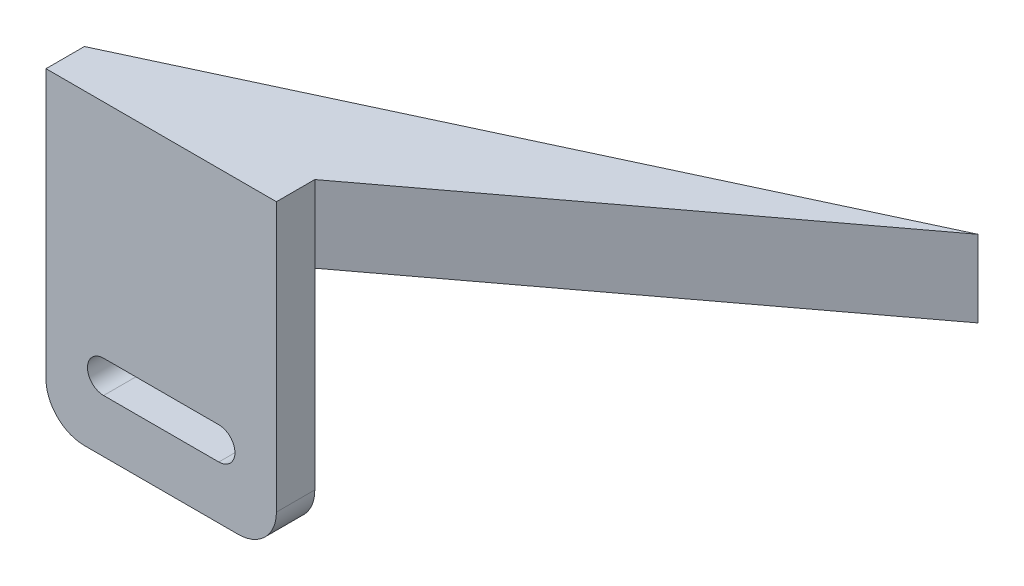
ISO-10303-21;
HEADER;
FILE_DESCRIPTION(('STEP AP214'),'2;1');
FILE_NAME('part.step','',(''),(''),'','','');
FILE_SCHEMA(('AUTOMOTIVE_DESIGN { 1 0 10303 214 1 1 1 1 }'));
ENDSEC;
DATA;
#1=APPLICATION_CONTEXT('core data for automotive mechanical design processes');
#2=APPLICATION_PROTOCOL_DEFINITION('international standard','automotive_design',2000,#1);
#3=PRODUCT_CONTEXT('',#1,'mechanical');
#4=PRODUCT('Part','Part','',(#3));
#5=PRODUCT_RELATED_PRODUCT_CATEGORY('part','',(#4));
#6=PRODUCT_DEFINITION_FORMATION('','',#4);
#7=PRODUCT_DEFINITION_CONTEXT('part definition',#1,'design');
#8=PRODUCT_DEFINITION('design','',#6,#7);
#9=PRODUCT_DEFINITION_SHAPE('','',#8);
#10=(LENGTH_UNIT() NAMED_UNIT(*) SI_UNIT(.MILLI.,.METRE.));
#11=(NAMED_UNIT(*) PLANE_ANGLE_UNIT() SI_UNIT($,.RADIAN.));
#12=(NAMED_UNIT(*) SI_UNIT($,.STERADIAN.) SOLID_ANGLE_UNIT());
#13=UNCERTAINTY_MEASURE_WITH_UNIT(LENGTH_MEASURE(1.E-05),#10,'distance_accuracy_value','');
#14=(GEOMETRIC_REPRESENTATION_CONTEXT(3) GLOBAL_UNCERTAINTY_ASSIGNED_CONTEXT((#13)) GLOBAL_UNIT_ASSIGNED_CONTEXT((#10,
#11,#12)) REPRESENTATION_CONTEXT('',''));
#15=CARTESIAN_POINT('',(0.,0.,0.));
#16=DIRECTION('',(0.,0.,1.));
#17=DIRECTION('',(1.,0.,0.));
#18=AXIS2_PLACEMENT_3D('',#15,#16,#17);
#19=CARTESIAN_POINT('',(0.,0.,0.));
#20=DIRECTION('',(0.,0.,-1.));
#21=DIRECTION('',(-1.,0.,0.));
#22=AXIS2_PLACEMENT_3D('',#19,#20,#21);
#23=PLANE('',#22);
#24=CARTESIAN_POINT('',(7.5,-11.,0.));
#25=DIRECTION('',(0.,0.,-1.));
#26=DIRECTION('',(-1.,0.,0.));
#27=AXIS2_PLACEMENT_3D('',#24,#25,#26);
#28=CIRCLE('',#27,2.1);
#29=CARTESIAN_POINT('',(7.5,-8.9,0.));
#30=VERTEX_POINT('',#29);
#31=CARTESIAN_POINT('',(7.5,-13.1,0.));
#32=VERTEX_POINT('',#31);
#33=EDGE_CURVE('E155',#30,#32,#28,.T.);
#34=ORIENTED_EDGE('',*,*,#33,.F.);
#35=DIRECTION('',(1.,0.,0.));
#36=VECTOR('',#35,1.);
#37=CARTESIAN_POINT('',(0.,-8.9,0.));
#38=LINE('',#37,#36);
#39=CARTESIAN_POINT('',(-7.5,-8.9,0.));
#40=VERTEX_POINT('',#39);
#41=EDGE_CURVE('E148',#40,#30,#38,.T.);
#42=ORIENTED_EDGE('',*,*,#41,.F.);
#43=CARTESIAN_POINT('',(-7.5,-11.,0.));
#44=DIRECTION('',(0.,0.,-1.));
#45=DIRECTION('',(-1.,0.,0.));
#46=AXIS2_PLACEMENT_3D('',#43,#44,#45);
#47=CIRCLE('',#46,2.1);
#48=CARTESIAN_POINT('',(-7.5,-13.1,0.));
#49=VERTEX_POINT('',#48);
#50=EDGE_CURVE('E128',#49,#40,#47,.T.);
#51=ORIENTED_EDGE('',*,*,#50,.F.);
#52=DIRECTION('',(-1.,0.,0.));
#53=VECTOR('',#52,1.);
#54=CARTESIAN_POINT('',(0.,-13.1,0.));
#55=LINE('',#54,#53);
#56=EDGE_CURVE('E153',#32,#49,#55,.T.);
#57=ORIENTED_EDGE('',*,*,#56,.F.);
#58=EDGE_LOOP('',(#34,#42,#51,#57));
#59=FACE_BOUND('',#58,.T.);
#60=DIRECTION('',(1.,0.,0.));
#61=VECTOR('',#60,1.);
#62=CARTESIAN_POINT('',(-15.,-20.,0.));
#63=LINE('',#62,#61);
#64=CARTESIAN_POINT('',(-10.,-20.,0.));
#65=VERTEX_POINT('',#64);
#66=CARTESIAN_POINT('',(10.,-20.,0.));
#67=VERTEX_POINT('',#66);
#68=EDGE_CURVE('E181',#65,#67,#63,.T.);
#69=ORIENTED_EDGE('',*,*,#68,.F.);
#70=CARTESIAN_POINT('',(-10.,-15.,0.));
#71=DIRECTION('',(0.,0.,-1.));
#72=DIRECTION('',(-1.,0.,0.));
#73=AXIS2_PLACEMENT_3D('',#70,#71,#72);
#74=CIRCLE('',#73,5.);
#75=CARTESIAN_POINT('',(-15.,-15.,0.));
#76=VERTEX_POINT('',#75);
#77=EDGE_CURVE('E209',#65,#76,#74,.T.);
#78=ORIENTED_EDGE('',*,*,#77,.T.);
#79=DIRECTION('',(0.,-1.,0.));
#80=VECTOR('',#79,1.);
#81=CARTESIAN_POINT('',(-15.,-20.,0.));
#82=LINE('',#81,#80);
#83=CARTESIAN_POINT('',(-15.,10.,0.));
#84=VERTEX_POINT('',#83);
#85=EDGE_CURVE('E191',#84,#76,#82,.T.);
#86=ORIENTED_EDGE('',*,*,#85,.F.);
#87=DIRECTION('',(1.,0.,0.));
#88=VECTOR('',#87,1.);
#89=CARTESIAN_POINT('',(15.,10.,0.));
#90=LINE('',#89,#88);
#91=CARTESIAN_POINT('',(15.,9.99999999999999,0.));
#92=VERTEX_POINT('',#91);
#93=EDGE_CURVE('E158',#84,#92,#90,.T.);
#94=ORIENTED_EDGE('',*,*,#93,.T.);
#95=DIRECTION('',(0.,1.,0.));
#96=VECTOR('',#95,1.);
#97=CARTESIAN_POINT('',(15.,-20.,0.));
#98=LINE('',#97,#96);
#99=CARTESIAN_POINT('',(15.,-15.,0.));
#100=VERTEX_POINT('',#99);
#101=EDGE_CURVE('E175',#100,#92,#98,.T.);
#102=ORIENTED_EDGE('',*,*,#101,.F.);
#103=CARTESIAN_POINT('',(10.,-15.,0.));
#104=DIRECTION('',(0.,0.,-1.));
#105=DIRECTION('',(-1.,0.,0.));
#106=AXIS2_PLACEMENT_3D('',#103,#104,#105);
#107=CIRCLE('',#106,5.);
#108=EDGE_CURVE('E207',#100,#67,#107,.T.);
#109=ORIENTED_EDGE('',*,*,#108,.T.);
#110=EDGE_LOOP('',(#69,#78,#86,#94,#102,#109));
#111=FACE_BOUND('',#110,.T.);
#112=ADVANCED_FACE('F33',(#59,#111),#23,.T.);
#113=CARTESIAN_POINT('',(15.,-20.,5.));
#114=DIRECTION('',(-1.,0.,0.));
#115=DIRECTION('',(0.,0.,1.));
#116=AXIS2_PLACEMENT_3D('',#113,#114,#115);
#117=PLANE('',#116);
#118=DIRECTION('',(0.,1.,0.));
#119=VECTOR('',#118,1.);
#120=CARTESIAN_POINT('',(15.,-20.,5.));
#121=LINE('',#120,#119);
#122=CARTESIAN_POINT('',(15.,-15.,5.));
#123=VERTEX_POINT('',#122);
#124=CARTESIAN_POINT('',(15.,20.,5.));
#125=VERTEX_POINT('',#124);
#126=EDGE_CURVE('E178',#123,#125,#121,.T.);
#127=ORIENTED_EDGE('',*,*,#126,.F.);
#128=DIRECTION('',(0.,0.,-1.));
#129=VECTOR('',#128,1.);
#130=CARTESIAN_POINT('',(15.,-15.,5.));
#131=LINE('',#130,#129);
#132=EDGE_CURVE('E11',#123,#100,#131,.T.);
#133=ORIENTED_EDGE('',*,*,#132,.T.);
#134=ORIENTED_EDGE('',*,*,#101,.T.);
#135=DIRECTION('',(0.,1.,0.));
#136=VECTOR('',#135,1.);
#137=CARTESIAN_POINT('',(15.,10.,0.));
#138=LINE('',#137,#136);
#139=CARTESIAN_POINT('',(15.,20.,0.));
#140=VERTEX_POINT('',#139);
#141=EDGE_CURVE('E168',#92,#140,#138,.T.);
#142=ORIENTED_EDGE('',*,*,#141,.T.);
#143=DIRECTION('',(0.,0.,-1.));
#144=VECTOR('',#143,1.);
#145=CARTESIAN_POINT('',(15.,20.,5.));
#146=LINE('',#145,#144);
#147=EDGE_CURVE('E199',#125,#140,#146,.T.);
#148=ORIENTED_EDGE('',*,*,#147,.F.);
#149=EDGE_LOOP('',(#127,#133,#134,#142,#148));
#150=FACE_BOUND('',#149,.T.);
#151=ADVANCED_FACE('F245',(#150),#117,.F.);
#152=CARTESIAN_POINT('',(-15.,20.,5.));
#153=DIRECTION('',(0.,-1.,0.));
#154=DIRECTION('',(0.,0.,-1.));
#155=AXIS2_PLACEMENT_3D('',#152,#153,#154);
#156=PLANE('',#155);
#157=ORIENTED_EDGE('',*,*,#147,.T.);
#158=DIRECTION('',(0.800078339231548,0.,-0.599895533482696));
#159=VECTOR('',#158,1.);
#160=CARTESIAN_POINT('',(64.3467560588549,20.,-37.));
#161=LINE('',#160,#159);
#162=CARTESIAN_POINT('',(64.3467560588549,20.,-37.));
#163=VERTEX_POINT('',#162);
#164=EDGE_CURVE('E157',#140,#163,#161,.T.);
#165=ORIENTED_EDGE('',*,*,#164,.T.);
#166=DIRECTION('',(-0.906307787036653,0.,0.422618261740694));
#167=VECTOR('',#166,1.);
#168=CARTESIAN_POINT('',(-15.,20.,0.));
#169=LINE('',#168,#167);
#170=CARTESIAN_POINT('',(-15.,20.,0.));
#171=VERTEX_POINT('',#170);
#172=EDGE_CURVE('E162',#163,#171,#169,.T.);
#173=ORIENTED_EDGE('',*,*,#172,.T.);
#174=DIRECTION('',(0.,0.,-1.));
#175=VECTOR('',#174,1.);
#176=CARTESIAN_POINT('',(-15.,20.,5.));
#177=LINE('',#176,#175);
#178=CARTESIAN_POINT('',(-15.,20.,5.));
#179=VERTEX_POINT('',#178);
#180=EDGE_CURVE('E189',#179,#171,#177,.T.);
#181=ORIENTED_EDGE('',*,*,#180,.F.);
#182=DIRECTION('',(-1.,0.,0.));
#183=VECTOR('',#182,1.);
#184=CARTESIAN_POINT('',(-15.,20.,5.));
#185=LINE('',#184,#183);
#186=EDGE_CURVE('E180',#125,#179,#185,.T.);
#187=ORIENTED_EDGE('',*,*,#186,.F.);
#188=EDGE_LOOP('',(#157,#165,#173,#181,#187));
#189=FACE_BOUND('',#188,.T.);
#190=ADVANCED_FACE('F237',(#189),#156,.F.);
#191=CARTESIAN_POINT('',(-15.,-20.,5.));
#192=DIRECTION('',(1.,0.,0.));
#193=DIRECTION('',(0.,0.,-1.));
#194=AXIS2_PLACEMENT_3D('',#191,#192,#193);
#195=PLANE('',#194);
#196=ORIENTED_EDGE('',*,*,#85,.T.);
#197=DIRECTION('',(0.,0.,-1.));
#198=VECTOR('',#197,1.);
#199=CARTESIAN_POINT('',(-15.,-15.,5.));
#200=LINE('',#199,#198);
#201=CARTESIAN_POINT('',(-15.,-15.,5.));
#202=VERTEX_POINT('',#201);
#203=EDGE_CURVE('E211',#76,#202,#200,.F.);
#204=ORIENTED_EDGE('',*,*,#203,.T.);
#205=DIRECTION('',(0.,-1.,0.));
#206=VECTOR('',#205,1.);
#207=CARTESIAN_POINT('',(-15.,-20.,5.));
#208=LINE('',#207,#206);
#209=EDGE_CURVE('E183',#179,#202,#208,.T.);
#210=ORIENTED_EDGE('',*,*,#209,.F.);
#211=ORIENTED_EDGE('',*,*,#180,.T.);
#212=EDGE_CURVE('E192',#171,#84,#82,.T.);
#213=ORIENTED_EDGE('',*,*,#212,.T.);
#214=EDGE_LOOP('',(#196,#204,#210,#211,#213));
#215=FACE_BOUND('',#214,.T.);
#216=ADVANCED_FACE('F230',(#215),#195,.F.);
#217=CARTESIAN_POINT('',(-15.,-20.,5.));
#218=DIRECTION('',(0.,1.,0.));
#219=DIRECTION('',(0.,0.,1.));
#220=AXIS2_PLACEMENT_3D('',#217,#218,#219);
#221=PLANE('',#220);
#222=DIRECTION('',(1.,0.,0.));
#223=VECTOR('',#222,1.);
#224=CARTESIAN_POINT('',(-15.,-20.,5.));
#225=LINE('',#224,#223);
#226=CARTESIAN_POINT('',(-10.,-20.,5.));
#227=VERTEX_POINT('',#226);
#228=CARTESIAN_POINT('',(10.,-20.,5.));
#229=VERTEX_POINT('',#228);
#230=EDGE_CURVE('E186',#227,#229,#225,.T.);
#231=ORIENTED_EDGE('',*,*,#230,.F.);
#232=DIRECTION('',(0.,0.,-1.));
#233=VECTOR('',#232,1.);
#234=CARTESIAN_POINT('',(-10.,-20.,5.));
#235=LINE('',#234,#233);
#236=EDGE_CURVE('E204',#227,#65,#235,.T.);
#237=ORIENTED_EDGE('',*,*,#236,.T.);
#238=ORIENTED_EDGE('',*,*,#68,.T.);
#239=DIRECTION('',(0.,0.,-1.));
#240=VECTOR('',#239,1.);
#241=CARTESIAN_POINT('',(10.,-20.,5.));
#242=LINE('',#241,#240);
#243=EDGE_CURVE('E202',#67,#229,#242,.F.);
#244=ORIENTED_EDGE('',*,*,#243,.T.);
#245=EDGE_LOOP('',(#231,#237,#238,#244));
#246=FACE_BOUND('',#245,.T.);
#247=ADVANCED_FACE('F222',(#246),#221,.F.);
#248=CARTESIAN_POINT('',(0.,0.,5.));
#249=DIRECTION('',(0.,0.,-1.));
#250=DIRECTION('',(-1.,0.,0.));
#251=AXIS2_PLACEMENT_3D('',#248,#249,#250);
#252=PLANE('',#251);
#253=DIRECTION('',(-1.,0.,0.));
#254=VECTOR('',#253,1.);
#255=CARTESIAN_POINT('',(7.5,-8.9,5.));
#256=LINE('',#255,#254);
#257=CARTESIAN_POINT('',(7.5,-8.9,5.));
#258=VERTEX_POINT('',#257);
#259=CARTESIAN_POINT('',(-7.5,-8.9,5.));
#260=VERTEX_POINT('',#259);
#261=EDGE_CURVE('E134',#258,#260,#256,.T.);
#262=ORIENTED_EDGE('',*,*,#261,.F.);
#263=CARTESIAN_POINT('',(7.5,-11.,5.));
#264=DIRECTION('',(0.,0.,1.));
#265=DIRECTION('',(1.,0.,0.));
#266=AXIS2_PLACEMENT_3D('',#263,#264,#265);
#267=CIRCLE('',#266,2.1);
#268=CARTESIAN_POINT('',(7.5,-13.1,5.));
#269=VERTEX_POINT('',#268);
#270=EDGE_CURVE('E56',#269,#258,#267,.T.);
#271=ORIENTED_EDGE('',*,*,#270,.F.);
#272=DIRECTION('',(1.,0.,0.));
#273=VECTOR('',#272,1.);
#274=CARTESIAN_POINT('',(7.5,-13.1,5.));
#275=LINE('',#274,#273);
#276=CARTESIAN_POINT('',(-7.5,-13.1,5.));
#277=VERTEX_POINT('',#276);
#278=EDGE_CURVE('E141',#277,#269,#275,.T.);
#279=ORIENTED_EDGE('',*,*,#278,.F.);
#280=CARTESIAN_POINT('',(-7.5,-11.,5.));
#281=DIRECTION('',(0.,0.,1.));
#282=DIRECTION('',(1.,0.,0.));
#283=AXIS2_PLACEMENT_3D('',#280,#281,#282);
#284=CIRCLE('',#283,2.1);
#285=EDGE_CURVE('E125',#260,#277,#284,.T.);
#286=ORIENTED_EDGE('',*,*,#285,.F.);
#287=EDGE_LOOP('',(#262,#271,#279,#286));
#288=FACE_BOUND('',#287,.T.);
#289=ORIENTED_EDGE('',*,*,#209,.T.);
#290=CARTESIAN_POINT('',(-10.,-15.,5.));
#291=DIRECTION('',(0.,0.,-1.));
#292=DIRECTION('',(-1.,0.,0.));
#293=AXIS2_PLACEMENT_3D('',#290,#291,#292);
#294=CIRCLE('',#293,5.);
#295=EDGE_CURVE('E41',#202,#227,#294,.F.);
#296=ORIENTED_EDGE('',*,*,#295,.T.);
#297=ORIENTED_EDGE('',*,*,#230,.T.);
#298=CARTESIAN_POINT('',(10.,-15.,5.));
#299=DIRECTION('',(0.,0.,-1.));
#300=DIRECTION('',(-1.,0.,0.));
#301=AXIS2_PLACEMENT_3D('',#298,#299,#300);
#302=CIRCLE('',#301,5.);
#303=EDGE_CURVE('E213',#229,#123,#302,.F.);
#304=ORIENTED_EDGE('',*,*,#303,.T.);
#305=ORIENTED_EDGE('',*,*,#126,.T.);
#306=ORIENTED_EDGE('',*,*,#186,.T.);
#307=EDGE_LOOP('',(#289,#296,#297,#304,#305,#306));
#308=FACE_BOUND('',#307,.T.);
#309=ADVANCED_FACE('F138',(#288,#308),#252,.F.);
#310=CARTESIAN_POINT('',(-15.,10.,0.));
#311=DIRECTION('',(-0.422618261740694,0.,-0.906307787036652));
#312=DIRECTION('',(-0.906307787036653,0.,0.422618261740694));
#313=AXIS2_PLACEMENT_3D('',#310,#311,#312);
#314=PLANE('',#313);
#315=ORIENTED_EDGE('',*,*,#172,.F.);
#316=DIRECTION('',(0.,1.,0.));
#317=VECTOR('',#316,1.);
#318=CARTESIAN_POINT('',(64.3467560588549,10.,-37.));
#319=LINE('',#318,#317);
#320=CARTESIAN_POINT('',(64.3467560588549,10.,-37.));
#321=VERTEX_POINT('',#320);
#322=EDGE_CURVE('E173',#321,#163,#319,.T.);
#323=ORIENTED_EDGE('',*,*,#322,.F.);
#324=DIRECTION('',(-0.906307787036653,0.,0.422618261740694));
#325=VECTOR('',#324,1.);
#326=CARTESIAN_POINT('',(-15.,10.,0.));
#327=LINE('',#326,#325);
#328=EDGE_CURVE('E165',#321,#84,#327,.T.);
#329=ORIENTED_EDGE('',*,*,#328,.T.);
#330=ORIENTED_EDGE('',*,*,#212,.F.);
#331=EDGE_LOOP('',(#315,#323,#329,#330));
#332=FACE_BOUND('',#331,.T.);
#333=ADVANCED_FACE('F234',(#332),#314,.T.);
#334=CARTESIAN_POINT('',(64.3467560588549,10.,-37.));
#335=DIRECTION('',(0.599895533482696,0.,0.800078339231547));
#336=DIRECTION('',(0.800078339231547,0.,-0.599895533482696));
#337=AXIS2_PLACEMENT_3D('',#334,#335,#336);
#338=PLANE('',#337);
#339=ORIENTED_EDGE('',*,*,#164,.F.);
#340=ORIENTED_EDGE('',*,*,#141,.F.);
#341=DIRECTION('',(0.800078339231548,0.,-0.599895533482696));
#342=VECTOR('',#341,1.);
#343=CARTESIAN_POINT('',(64.3467560588549,10.,-37.));
#344=LINE('',#343,#342);
#345=EDGE_CURVE('E161',#92,#321,#344,.T.);
#346=ORIENTED_EDGE('',*,*,#345,.T.);
#347=ORIENTED_EDGE('',*,*,#322,.T.);
#348=EDGE_LOOP('',(#339,#340,#346,#347));
#349=FACE_BOUND('',#348,.T.);
#350=ADVANCED_FACE('F242',(#349),#338,.T.);
#351=CARTESIAN_POINT('',(0.,10.,0.));
#352=DIRECTION('',(0.,1.,0.));
#353=DIRECTION('',(0.,0.,1.));
#354=AXIS2_PLACEMENT_3D('',#351,#352,#353);
#355=PLANE('',#354);
#356=ORIENTED_EDGE('',*,*,#93,.F.);
#357=ORIENTED_EDGE('',*,*,#328,.F.);
#358=ORIENTED_EDGE('',*,*,#345,.F.);
#359=EDGE_LOOP('',(#356,#357,#358));
#360=FACE_BOUND('',#359,.T.);
#361=ADVANCED_FACE('F250',(#360),#355,.F.);
#362=CARTESIAN_POINT('',(-10.,-15.,5.));
#363=DIRECTION('',(0.,0.,-1.));
#364=DIRECTION('',(-1.,0.,0.));
#365=AXIS2_PLACEMENT_3D('',#362,#363,#364);
#366=CYLINDRICAL_SURFACE('',#365,5.);
#367=ORIENTED_EDGE('',*,*,#295,.F.);
#368=ORIENTED_EDGE('',*,*,#203,.F.);
#369=ORIENTED_EDGE('',*,*,#77,.F.);
#370=ORIENTED_EDGE('',*,*,#236,.F.);
#371=EDGE_LOOP('',(#367,#368,#369,#370));
#372=FACE_BOUND('',#371,.T.);
#373=ADVANCED_FACE('F225',(#372),#366,.T.);
#374=CARTESIAN_POINT('',(10.,-15.,5.));
#375=DIRECTION('',(0.,0.,-1.));
#376=DIRECTION('',(-1.,0.,0.));
#377=AXIS2_PLACEMENT_3D('',#374,#375,#376);
#378=CYLINDRICAL_SURFACE('',#377,5.);
#379=ORIENTED_EDGE('',*,*,#303,.F.);
#380=ORIENTED_EDGE('',*,*,#243,.F.);
#381=ORIENTED_EDGE('',*,*,#108,.F.);
#382=ORIENTED_EDGE('',*,*,#132,.F.);
#383=EDGE_LOOP('',(#379,#380,#381,#382));
#384=FACE_BOUND('',#383,.T.);
#385=ADVANCED_FACE('F35',(#384),#378,.T.);
#386=CARTESIAN_POINT('',(7.5,-11.,-5.));
#387=DIRECTION('',(0.,0.,1.));
#388=DIRECTION('',(1.,0.,0.));
#389=AXIS2_PLACEMENT_3D('',#386,#387,#388);
#390=CYLINDRICAL_SURFACE('',#389,2.1);
#391=ORIENTED_EDGE('',*,*,#33,.T.);
#392=DIRECTION('',(0.,0.,1.));
#393=VECTOR('',#392,1.);
#394=CARTESIAN_POINT('',(7.5,-13.1,-5.));
#395=LINE('',#394,#393);
#396=EDGE_CURVE('E146',#32,#269,#395,.T.);
#397=ORIENTED_EDGE('',*,*,#396,.T.);
#398=ORIENTED_EDGE('',*,*,#270,.T.);
#399=DIRECTION('',(0.,0.,1.));
#400=VECTOR('',#399,1.);
#401=CARTESIAN_POINT('',(7.5,-8.9,-5.));
#402=LINE('',#401,#400);
#403=EDGE_CURVE('E131',#30,#258,#402,.T.);
#404=ORIENTED_EDGE('',*,*,#403,.F.);
#405=EDGE_LOOP('',(#391,#397,#398,#404));
#406=FACE_BOUND('',#405,.T.);
#407=ADVANCED_FACE('F335',(#406),#390,.F.);
#408=CARTESIAN_POINT('',(7.5,-13.1,-5.));
#409=DIRECTION('',(0.,-1.,0.));
#410=DIRECTION('',(1.,0.,0.));
#411=AXIS2_PLACEMENT_3D('',#408,#409,#410);
#412=PLANE('',#411);
#413=ORIENTED_EDGE('',*,*,#56,.T.);
#414=DIRECTION('',(0.,0.,1.));
#415=VECTOR('',#414,1.);
#416=CARTESIAN_POINT('',(-7.5,-13.1,-5.));
#417=LINE('',#416,#415);
#418=EDGE_CURVE('E130',#49,#277,#417,.T.);
#419=ORIENTED_EDGE('',*,*,#418,.T.);
#420=ORIENTED_EDGE('',*,*,#278,.T.);
#421=ORIENTED_EDGE('',*,*,#396,.F.);
#422=EDGE_LOOP('',(#413,#419,#420,#421));
#423=FACE_BOUND('',#422,.T.);
#424=ADVANCED_FACE('F348',(#423),#412,.F.);
#425=CARTESIAN_POINT('',(-7.5,-11.,-5.));
#426=DIRECTION('',(0.,0.,1.));
#427=DIRECTION('',(1.,0.,0.));
#428=AXIS2_PLACEMENT_3D('',#425,#426,#427);
#429=CYLINDRICAL_SURFACE('',#428,2.1);
#430=ORIENTED_EDGE('',*,*,#50,.T.);
#431=DIRECTION('',(0.,0.,1.));
#432=VECTOR('',#431,1.);
#433=CARTESIAN_POINT('',(-7.5,-8.9,-5.));
#434=LINE('',#433,#432);
#435=EDGE_CURVE('E48',#40,#260,#434,.T.);
#436=ORIENTED_EDGE('',*,*,#435,.T.);
#437=ORIENTED_EDGE('',*,*,#285,.T.);
#438=ORIENTED_EDGE('',*,*,#418,.F.);
#439=EDGE_LOOP('',(#430,#436,#437,#438));
#440=FACE_BOUND('',#439,.T.);
#441=ADVANCED_FACE('F122',(#440),#429,.F.);
#442=CARTESIAN_POINT('',(7.5,-8.9,-5.));
#443=DIRECTION('',(0.,1.,0.));
#444=DIRECTION('',(-1.,0.,0.));
#445=AXIS2_PLACEMENT_3D('',#442,#443,#444);
#446=PLANE('',#445);
#447=ORIENTED_EDGE('',*,*,#41,.T.);
#448=ORIENTED_EDGE('',*,*,#403,.T.);
#449=ORIENTED_EDGE('',*,*,#261,.T.);
#450=ORIENTED_EDGE('',*,*,#435,.F.);
#451=EDGE_LOOP('',(#447,#448,#449,#450));
#452=FACE_BOUND('',#451,.T.);
#453=ADVANCED_FACE('F135',(#452),#446,.F.);
#454=CLOSED_SHELL('',(#112,#151,#190,#216,#247,#309,#333,#350,#361,#373,#385,#407,#424,#441,#453));
#455=MANIFOLD_SOLID_BREP('B2',#454);
#456=ADVANCED_BREP_SHAPE_REPRESENTATION('',(#18,#455),#14);
#457=SHAPE_DEFINITION_REPRESENTATION(#9,#456);
ENDSEC;
END-ISO-10303-21;
